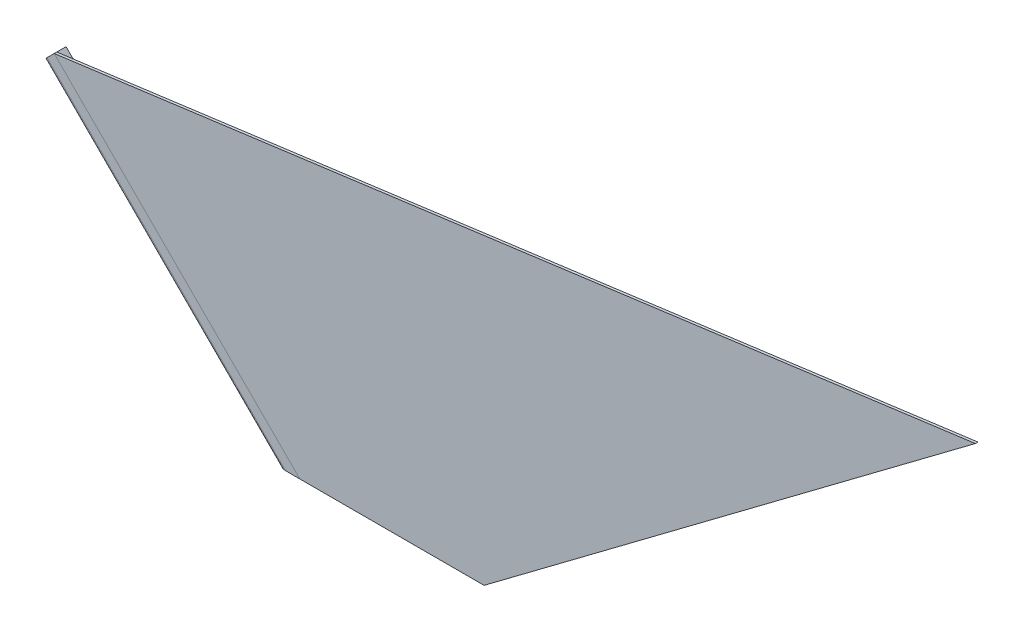
ISO-10303-21;
HEADER;
FILE_DESCRIPTION(('STEP AP214'),'2;1');
FILE_NAME('part.step','',(''),(''),'','','');
FILE_SCHEMA(('AUTOMOTIVE_DESIGN { 1 0 10303 214 1 1 1 1 }'));
ENDSEC;
DATA;
#1=APPLICATION_CONTEXT('core data for automotive mechanical design processes');
#2=APPLICATION_PROTOCOL_DEFINITION('international standard','automotive_design',2000,#1);
#3=PRODUCT_CONTEXT('',#1,'mechanical');
#4=PRODUCT('Part','Part','',(#3));
#5=PRODUCT_RELATED_PRODUCT_CATEGORY('part','',(#4));
#6=PRODUCT_DEFINITION_FORMATION('','',#4);
#7=PRODUCT_DEFINITION_CONTEXT('part definition',#1,'design');
#8=PRODUCT_DEFINITION('design','',#6,#7);
#9=PRODUCT_DEFINITION_SHAPE('','',#8);
#10=(LENGTH_UNIT() NAMED_UNIT(*) SI_UNIT(.MILLI.,.METRE.));
#11=(NAMED_UNIT(*) PLANE_ANGLE_UNIT() SI_UNIT($,.RADIAN.));
#12=(NAMED_UNIT(*) SI_UNIT($,.STERADIAN.) SOLID_ANGLE_UNIT());
#13=UNCERTAINTY_MEASURE_WITH_UNIT(LENGTH_MEASURE(1.E-05),#10,'distance_accuracy_value','');
#14=(GEOMETRIC_REPRESENTATION_CONTEXT(3) GLOBAL_UNCERTAINTY_ASSIGNED_CONTEXT((#13)) GLOBAL_UNIT_ASSIGNED_CONTEXT((#10,
#11,#12)) REPRESENTATION_CONTEXT('',''));
#15=CARTESIAN_POINT('',(0.,0.,0.));
#16=DIRECTION('',(0.,0.,1.));
#17=DIRECTION('',(1.,0.,0.));
#18=AXIS2_PLACEMENT_3D('',#15,#16,#17);
#19=CARTESIAN_POINT('',(-158.856804151049,145.943195848951,-1.27));
#20=DIRECTION('',(-0.707106781186548,0.707106781186548,0.));
#21=DIRECTION('',(-0.707106781186548,-0.707106781186548,0.));
#22=AXIS2_PLACEMENT_3D('',#19,#20,#21);
#23=PLANE('',#22);
#24=DIRECTION('',(0.707106781186548,0.707106781186548,0.));
#25=VECTOR('',#24,1.);
#26=CARTESIAN_POINT('',(-158.856804151049,145.943195848951,-1.27));
#27=LINE('',#26,#25);
#28=CARTESIAN_POINT('',(-158.856804151049,145.943195848951,-1.27));
#29=VERTEX_POINT('',#28);
#30=CARTESIAN_POINT('',(-157.734272135915,147.065727864085,-1.27));
#31=VERTEX_POINT('',#30);
#32=EDGE_CURVE('E12',#29,#31,#27,.T.);
#33=ORIENTED_EDGE('',*,*,#32,.F.);
#34=CARTESIAN_POINT('',(-156.836246523808,147.963753476192,-1.27));
#35=DIRECTION('',(-0.707106781186548,0.707106781186548,0.));
#36=DIRECTION('',(-0.707106781186548,-0.707106781186548,0.));
#37=AXIS2_PLACEMENT_3D('',#34,#35,#36);
#38=CIRCLE('',#37,2.8575);
#39=CARTESIAN_POINT('',(-156.836246523808,147.963753476192,1.5875));
#40=VERTEX_POINT('',#39);
#41=EDGE_CURVE('E149',#40,#29,#38,.F.);
#42=ORIENTED_EDGE('',*,*,#41,.F.);
#43=DIRECTION('',(0.,0.,1.));
#44=VECTOR('',#43,1.);
#45=CARTESIAN_POINT('',(-156.836246523808,147.963753476192,0.));
#46=LINE('',#45,#44);
#47=CARTESIAN_POINT('',(-156.836246523808,147.963753476192,0.));
#48=VERTEX_POINT('',#47);
#49=EDGE_CURVE('E58',#48,#40,#46,.T.);
#50=ORIENTED_EDGE('',*,*,#49,.F.);
#51=CARTESIAN_POINT('',(-156.836246523808,147.963753476192,-1.27));
#52=DIRECTION('',(-0.707106781186548,0.707106781186548,0.));
#53=DIRECTION('',(0.,0.,-1.));
#54=AXIS2_PLACEMENT_3D('',#51,#52,#53);
#55=CIRCLE('',#54,1.27);
#56=EDGE_CURVE('E164',#48,#31,#55,.F.);
#57=ORIENTED_EDGE('',*,*,#56,.T.);
#58=EDGE_LOOP('',(#33,#42,#50,#57));
#59=FACE_BOUND('',#58,.T.);
#60=ADVANCED_FACE('F50',(#59),#23,.T.);
#61=CARTESIAN_POINT('',(-156.836246523808,147.963753476192,0.));
#62=DIRECTION('',(-0.707106781186548,0.707106781186548,0.));
#63=DIRECTION('',(-0.707106781186548,-0.707106781186548,0.));
#64=AXIS2_PLACEMENT_3D('',#61,#62,#63);
#65=PLANE('',#64);
#66=DIRECTION('',(0.,0.,-1.));
#67=VECTOR('',#66,1.);
#68=CARTESIAN_POINT('',(-158.856804151049,145.943195848951,1.5875));
#69=LINE('',#68,#67);
#70=CARTESIAN_POINT('',(-158.856804151049,145.943195848951,-11.1125));
#71=VERTEX_POINT('',#70);
#72=EDGE_CURVE('E205',#29,#71,#69,.T.);
#73=ORIENTED_EDGE('',*,*,#72,.F.);
#74=ORIENTED_EDGE('',*,*,#32,.T.);
#75=DIRECTION('',(0.,0.,-1.));
#76=VECTOR('',#75,1.);
#77=CARTESIAN_POINT('',(-157.734272135915,147.065727864085,1.5875));
#78=LINE('',#77,#76);
#79=CARTESIAN_POINT('',(-157.734272135915,147.065727864085,-11.1125));
#80=VERTEX_POINT('',#79);
#81=EDGE_CURVE('E221',#31,#80,#78,.T.);
#82=ORIENTED_EDGE('',*,*,#81,.T.);
#83=DIRECTION('',(0.707106781186548,0.707106781186548,0.));
#84=VECTOR('',#83,1.);
#85=CARTESIAN_POINT('',(-158.856804151049,145.943195848951,-11.1125));
#86=LINE('',#85,#84);
#87=EDGE_CURVE('E227',#71,#80,#86,.T.);
#88=ORIENTED_EDGE('',*,*,#87,.F.);
#89=EDGE_LOOP('',(#73,#74,#82,#88));
#90=FACE_BOUND('',#89,.T.);
#91=ADVANCED_FACE('F244',(#90),#65,.T.);
#92=CARTESIAN_POINT('',(4.78856633484592,-15.4571106066761,1.5875));
#93=DIRECTION('',(0.707106781186548,0.707106781186548,0.));
#94=DIRECTION('',(-0.707106781186548,0.707106781186548,0.));
#95=AXIS2_PLACEMENT_3D('',#92,#93,#94);
#96=PLANE('',#95);
#97=DIRECTION('',(-0.707106781186548,0.707106781186548,0.));
#98=VECTOR('',#97,1.);
#99=CARTESIAN_POINT('',(4.78856633484592,-15.4571106066761,-1.27));
#100=LINE('',#99,#98);
#101=CARTESIAN_POINT('',(-11.7910762869638,1.12253201513365,-1.27));
#102=VERTEX_POINT('',#101);
#103=EDGE_CURVE('E165',#102,#31,#100,.T.);
#104=ORIENTED_EDGE('',*,*,#103,.F.);
#105=DIRECTION('',(0.,0.,1.));
#106=VECTOR('',#105,1.);
#107=CARTESIAN_POINT('',(-11.7910762869638,1.12253201513364,1.5875));
#108=LINE('',#107,#106);
#109=CARTESIAN_POINT('',(-11.7910762869638,1.12253201513364,-11.1125));
#110=VERTEX_POINT('',#109);
#111=EDGE_CURVE('E131',#110,#102,#108,.T.);
#112=ORIENTED_EDGE('',*,*,#111,.F.);
#113=DIRECTION('',(-0.707106781186548,0.707106781186548,0.));
#114=VECTOR('',#113,1.);
#115=CARTESIAN_POINT('',(4.78856633484592,-15.4571106066761,-11.1125));
#116=LINE('',#115,#114);
#117=EDGE_CURVE('E158',#110,#80,#116,.T.);
#118=ORIENTED_EDGE('',*,*,#117,.T.);
#119=ORIENTED_EDGE('',*,*,#81,.F.);
#120=EDGE_LOOP('',(#104,#112,#118,#119));
#121=FACE_BOUND('',#120,.T.);
#122=ADVANCED_FACE('F222',(#121),#96,.T.);
#123=CARTESIAN_POINT('',(5.68659194695287,-14.5590849945691,-1.27));
#124=DIRECTION('',(-0.707106781186548,0.707106781186548,0.));
#125=DIRECTION('',(-0.707106781186548,-0.707106781186548,0.));
#126=AXIS2_PLACEMENT_3D('',#123,#124,#125);
#127=CYLINDRICAL_SURFACE('',#126,1.27);
#128=DIRECTION('',(-0.707106781186548,0.707106781186548,0.));
#129=VECTOR('',#128,1.);
#130=CARTESIAN_POINT('',(5.68659194695287,-14.5590849945691,0.));
#131=LINE('',#130,#129);
#132=CARTESIAN_POINT('',(-8.87249304761628,0.,0.));
#133=VERTEX_POINT('',#132);
#134=EDGE_CURVE('E168',#133,#48,#131,.T.);
#135=ORIENTED_EDGE('',*,*,#134,.F.);
#136=CARTESIAN_POINT('',(-8.87249304761628,0.,0.));
#137=CARTESIAN_POINT('',(-8.97990035737662,0.041310503754024,-2.84074469528321E-05));
#138=CARTESIAN_POINT('',(-9.08731642119603,0.0826243744537719,-0.00258176607408671));
#139=CARTESIAN_POINT('',(-9.30251981168437,0.165394909256933,-0.0129652391565513));
#140=CARTESIAN_POINT('',(-9.41030590779784,0.206851100069783,-0.020824448012069));
#141=CARTESIAN_POINT('',(-9.6256485485179,0.289675192654517,-0.0420742437074032));
#142=CARTESIAN_POINT('',(-9.73320405501698,0.331042695154281,-0.0554770504268105));
#143=CARTESIAN_POINT('',(-9.94699261326504,0.413269063711224,-0.0881757209866942));
#144=CARTESIAN_POINT('',(-10.0532295926113,0.454129440382759,-0.107441680891336));
#145=CARTESIAN_POINT('',(-10.2643077880244,0.535313361695395,-0.152539948879866));
#146=CARTESIAN_POINT('',(-10.3691510432101,0.575637690612987,-0.178361208890602));
#147=CARTESIAN_POINT('',(-10.5768255034913,0.65551248302888,-0.237617930507188));
#148=CARTESIAN_POINT('',(-10.6796596791354,0.695064089045806,-0.271041052929458));
#149=CARTESIAN_POINT('',(-10.8154474198744,0.747290143176187,-0.322116269602496));
#150=CARTESIAN_POINT('',(-10.8497673145441,0.760490102664537,-0.335635219039178));
#151=CARTESIAN_POINT('',(-10.9179776026383,0.786724828854628,-0.363864516554097));
#152=CARTESIAN_POINT('',(-10.951867977012,0.799759588229113,-0.378574917265352));
#153=CARTESIAN_POINT('',(-11.0531485279253,0.838713646272707,-0.42482302070147));
#154=CARTESIAN_POINT('',(-11.1197790489255,0.864340769734326,-0.458341781147276));
#155=CARTESIAN_POINT('',(-11.2264979029612,0.905386482824975,-0.518646467039939));
#156=CARTESIAN_POINT('',(-11.2675247411611,0.921166035978759,-0.543527325698283));
#157=CARTESIAN_POINT('',(-11.3478475553631,0.95205942605646,-0.596432048009351));
#158=CARTESIAN_POINT('',(-11.3871420082739,0.967172677176012,-0.624458603483086));
#159=CARTESIAN_POINT('',(-11.4629683693596,0.996336662208959,-0.683986356518847));
#160=CARTESIAN_POINT('',(-11.4995179140532,1.01039417939881,-0.715461465533412));
#161=CARTESIAN_POINT('',(-11.5689796584078,1.0371102349198,-0.78267056435937));
#162=CARTESIAN_POINT('',(-11.6019001283773,1.04977195413885,-0.818394468084932));
#163=CARTESIAN_POINT('',(-11.6542871448456,1.06992080662666,-0.884615365051905));
#164=CARTESIAN_POINT('',(-11.6750011980869,1.07788775018102,-0.913968549718548));
#165=CARTESIAN_POINT('',(-11.7124602302953,1.09229507026115,-0.975499086311298));
#166=CARTESIAN_POINT('',(-11.7292075543304,1.09873634873619,-1.00767475413285));
#167=CARTESIAN_POINT('',(-11.7553450002232,1.10878921254113,-1.06975848414488));
#168=CARTESIAN_POINT('',(-11.7654505305935,1.11267595499124,-1.09931679626145));
#169=CARTESIAN_POINT('',(-11.7809038465429,1.1186195380487,-1.15980925416742));
#170=CARTESIAN_POINT('',(-11.7862640529346,1.12068115589168,-1.19073958427366));
#171=CARTESIAN_POINT('',(-11.7896791430526,1.12199465209088,-1.22988864984594));
#172=CARTESIAN_POINT('',(-11.7902026517786,1.12219600160088,-1.23790235721289));
#173=CARTESIAN_POINT('',(-11.7909008176836,1.12246452694897,-1.25394306601032));
#174=CARTESIAN_POINT('',(-11.7910756543296,1.12253177181282,-1.2619700584722));
#175=CARTESIAN_POINT('',(-11.7910762869638,1.12253201513364,-1.27));
#176=B_SPLINE_CURVE_WITH_KNOTS('',3,(#136,#137,#138,#139,#140,#141,#142,#143,#144,#145,#146,
#147,#148,#149,#150,#151,#152,#153,#154,#155,#156,#157,#158,#159,#160,#161,#162,#163,#164,#165,
#166,#167,#168,#169,#170,#171,#172,#173,#174,#175),.UNSPECIFIED.,.F.,.F.,(4,2,2,2,2,2,2,2,2,2,2,
2,2,2,2,2,2,2,2,4),(0.,0.345220297635823,0.692349138928181,1.04024727708805,1.38639994589045,
1.73197304979134,2.07698917995531,2.19450279832984,2.31202161076757,2.54831130560641,
2.6997427013205,2.85130468161468,3.0017903460329,3.1519256514949,3.26205437403111,
3.37211782677707,3.4661900299202,3.56001526621733,3.58410945098179,3.6081912308874),.UNSPECIFIED.);
#177=EDGE_CURVE('E133',#133,#102,#176,.T.);
#178=ORIENTED_EDGE('',*,*,#177,.T.);
#179=ORIENTED_EDGE('',*,*,#103,.T.);
#180=ORIENTED_EDGE('',*,*,#56,.F.);
#181=EDGE_LOOP('',(#135,#178,#179,#180));
#182=FACE_BOUND('',#181,.T.);
#183=ADVANCED_FACE('F217',(#182),#127,.F.);
#184=CARTESIAN_POINT('',(10.122838470761,-10.122838470761,0.));
#185=DIRECTION('',(0.,0.,-1.));
#186=DIRECTION('',(-1.,0.,0.));
#187=AXIS2_PLACEMENT_3D('',#184,#185,#186);
#188=PLANE('',#187);
#189=DIRECTION('',(-0.707106781186548,0.707106781186548,0.));
#190=VECTOR('',#189,1.);
#191=CARTESIAN_POINT('',(10.122838470761,-10.122838470761,0.));
#192=LINE('',#191,#190);
#193=CARTESIAN_POINT('',(0.,0.,0.));
#194=VERTEX_POINT('',#193);
#195=CARTESIAN_POINT('',(-152.4,152.4,0.));
#196=VERTEX_POINT('',#195);
#197=EDGE_CURVE('E176',#194,#196,#192,.T.);
#198=ORIENTED_EDGE('',*,*,#197,.F.);
#199=DIRECTION('',(-1.,0.,0.));
#200=VECTOR('',#199,1.);
#201=CARTESIAN_POINT('',(10.122838470761,0.,0.));
#202=LINE('',#201,#200);
#203=EDGE_CURVE('E259',#133,#194,#202,.F.);
#204=ORIENTED_EDGE('',*,*,#203,.F.);
#205=ORIENTED_EDGE('',*,*,#134,.T.);
#206=DIRECTION('',(-0.707106781186548,-0.707106781186548,0.));
#207=VECTOR('',#206,1.);
#208=CARTESIAN_POINT('',(-152.4,152.4,0.));
#209=LINE('',#208,#207);
#210=EDGE_CURVE('E198',#196,#48,#209,.T.);
#211=ORIENTED_EDGE('',*,*,#210,.F.);
#212=EDGE_LOOP('',(#198,#204,#205,#211));
#213=FACE_BOUND('',#212,.T.);
#214=ADVANCED_FACE('F270',(#213),#188,.T.);
#215=CARTESIAN_POINT('',(10.122838470761,-10.122838470761,0.));
#216=DIRECTION('',(-0.707106781186548,-0.707106781186548,0.));
#217=DIRECTION('',(0.707106781186548,-0.707106781186548,0.));
#218=AXIS2_PLACEMENT_3D('',#215,#216,#217);
#219=PLANE('',#218);
#220=DIRECTION('',(0.,0.,1.));
#221=VECTOR('',#220,1.);
#222=CARTESIAN_POINT('',(0.,0.,1.5875));
#223=LINE('',#222,#221);
#224=CARTESIAN_POINT('',(0.,0.,1.5875));
#225=VERTEX_POINT('',#224);
#226=EDGE_CURVE('E145',#225,#194,#223,.F.);
#227=ORIENTED_EDGE('',*,*,#226,.T.);
#228=ORIENTED_EDGE('',*,*,#197,.T.);
#229=DIRECTION('',(0.,0.,1.));
#230=VECTOR('',#229,1.);
#231=CARTESIAN_POINT('',(-152.4,152.4,0.));
#232=LINE('',#231,#230);
#233=CARTESIAN_POINT('',(-152.4,152.4,1.5875));
#234=VERTEX_POINT('',#233);
#235=EDGE_CURVE('E191',#196,#234,#232,.T.);
#236=ORIENTED_EDGE('',*,*,#235,.T.);
#237=DIRECTION('',(-0.707106781186548,0.707106781186548,0.));
#238=VECTOR('',#237,1.);
#239=CARTESIAN_POINT('',(10.122838470761,-10.122838470761,1.5875));
#240=LINE('',#239,#238);
#241=EDGE_CURVE('E156',#225,#234,#240,.T.);
#242=ORIENTED_EDGE('',*,*,#241,.F.);
#243=EDGE_LOOP('',(#227,#228,#236,#242));
#244=FACE_BOUND('',#243,.T.);
#245=ADVANCED_FACE('F192',(#244),#219,.F.);
#246=CARTESIAN_POINT('',(10.122838470761,-10.122838470761,1.5875));
#247=DIRECTION('',(0.,0.,-1.));
#248=DIRECTION('',(-1.,0.,0.));
#249=AXIS2_PLACEMENT_3D('',#246,#247,#248);
#250=PLANE('',#249);
#251=DIRECTION('',(1.,0.,0.));
#252=VECTOR('',#251,1.);
#253=CARTESIAN_POINT('',(10.122838470761,0.,1.5875));
#254=LINE('',#253,#252);
#255=CARTESIAN_POINT('',(-8.87249304761628,0.,1.5875));
#256=VERTEX_POINT('',#255);
#257=EDGE_CURVE('E127',#256,#225,#254,.T.);
#258=ORIENTED_EDGE('',*,*,#257,.T.);
#259=ORIENTED_EDGE('',*,*,#241,.T.);
#260=DIRECTION('',(-0.707106781186548,-0.707106781186548,0.));
#261=VECTOR('',#260,1.);
#262=CARTESIAN_POINT('',(-152.4,152.4,1.5875));
#263=LINE('',#262,#261);
#264=EDGE_CURVE('E187',#234,#40,#263,.T.);
#265=ORIENTED_EDGE('',*,*,#264,.T.);
#266=DIRECTION('',(-0.707106781186548,0.707106781186548,0.));
#267=VECTOR('',#266,1.);
#268=CARTESIAN_POINT('',(5.68659194695287,-14.5590849945691,1.5875));
#269=LINE('',#268,#267);
#270=EDGE_CURVE('E151',#256,#40,#269,.T.);
#271=ORIENTED_EDGE('',*,*,#270,.F.);
#272=EDGE_LOOP('',(#258,#259,#265,#271));
#273=FACE_BOUND('',#272,.T.);
#274=ADVANCED_FACE('F185',(#273),#250,.F.);
#275=CARTESIAN_POINT('',(5.68659194695287,-14.5590849945691,-1.27));
#276=DIRECTION('',(-0.707106781186548,0.707106781186548,0.));
#277=DIRECTION('',(-0.707106781186548,-0.707106781186548,0.));
#278=AXIS2_PLACEMENT_3D('',#275,#276,#277);
#279=CYLINDRICAL_SURFACE('',#278,2.8575);
#280=CARTESIAN_POINT('',(-8.87249304761628,0.,-1.27));
#281=DIRECTION('',(0.,1.,0.));
#282=DIRECTION('',(-1.,0.,0.));
#283=AXIS2_PLACEMENT_3D('',#280,#281,#282);
#284=ELLIPSE('',#283,4.04111525448112,2.8575);
#285=CARTESIAN_POINT('',(-12.9136083020974,0.,-1.27));
#286=VERTEX_POINT('',#285);
#287=EDGE_CURVE('E115',#286,#256,#284,.T.);
#288=ORIENTED_EDGE('',*,*,#287,.T.);
#289=ORIENTED_EDGE('',*,*,#270,.T.);
#290=ORIENTED_EDGE('',*,*,#41,.T.);
#291=DIRECTION('',(-0.707106781186548,0.707106781186548,0.));
#292=VECTOR('',#291,1.);
#293=CARTESIAN_POINT('',(3.6660343197123,-16.5796426218097,-1.27));
#294=LINE('',#293,#292);
#295=EDGE_CURVE('E141',#286,#29,#294,.T.);
#296=ORIENTED_EDGE('',*,*,#295,.F.);
#297=EDGE_LOOP('',(#288,#289,#290,#296));
#298=FACE_BOUND('',#297,.T.);
#299=ADVANCED_FACE('F147',(#298),#279,.T.);
#300=CARTESIAN_POINT('',(3.6660343197123,-16.5796426218097,1.5875));
#301=DIRECTION('',(0.707106781186548,0.707106781186548,0.));
#302=DIRECTION('',(-0.707106781186548,0.707106781186548,0.));
#303=AXIS2_PLACEMENT_3D('',#300,#301,#302);
#304=PLANE('',#303);
#305=DIRECTION('',(0.,0.,1.));
#306=VECTOR('',#305,1.);
#307=CARTESIAN_POINT('',(-12.9136083020974,0.,1.5875));
#308=LINE('',#307,#306);
#309=CARTESIAN_POINT('',(-12.9136083020974,0.,-11.1125));
#310=VERTEX_POINT('',#309);
#311=EDGE_CURVE('E65',#310,#286,#308,.T.);
#312=ORIENTED_EDGE('',*,*,#311,.T.);
#313=ORIENTED_EDGE('',*,*,#295,.T.);
#314=ORIENTED_EDGE('',*,*,#72,.T.);
#315=DIRECTION('',(-0.707106781186548,0.707106781186548,0.));
#316=VECTOR('',#315,1.);
#317=CARTESIAN_POINT('',(3.6660343197123,-16.5796426218097,-11.1125));
#318=LINE('',#317,#316);
#319=EDGE_CURVE('E143',#310,#71,#318,.T.);
#320=ORIENTED_EDGE('',*,*,#319,.F.);
#321=EDGE_LOOP('',(#312,#313,#314,#320));
#322=FACE_BOUND('',#321,.T.);
#323=ADVANCED_FACE('F139',(#322),#304,.F.);
#324=CARTESIAN_POINT('',(3.6660343197123,-16.5796426218097,-11.1125));
#325=DIRECTION('',(0.,0.,1.));
#326=DIRECTION('',(1.,0.,0.));
#327=AXIS2_PLACEMENT_3D('',#324,#325,#326);
#328=PLANE('',#327);
#329=DIRECTION('',(-0.707106781186548,-0.707106781186548,0.));
#330=VECTOR('',#329,1.);
#331=CARTESIAN_POINT('',(-12.9136083020974,0.,-11.1125));
#332=LINE('',#331,#330);
#333=EDGE_CURVE('E134',#310,#110,#332,.F.);
#334=ORIENTED_EDGE('',*,*,#333,.F.);
#335=ORIENTED_EDGE('',*,*,#319,.T.);
#336=ORIENTED_EDGE('',*,*,#87,.T.);
#337=ORIENTED_EDGE('',*,*,#117,.F.);
#338=EDGE_LOOP('',(#334,#335,#336,#337));
#339=FACE_BOUND('',#338,.T.);
#340=ADVANCED_FACE('F246',(#339),#328,.F.);
#341=CARTESIAN_POINT('',(-156.836246523808,147.963753476192,-1.27));
#342=DIRECTION('',(-0.707106781186548,0.707106781186548,0.));
#343=DIRECTION('',(0.,0.,-1.));
#344=AXIS2_PLACEMENT_3D('',#341,#342,#343);
#345=PLANE('',#344);
#346=ORIENTED_EDGE('',*,*,#210,.T.);
#347=ORIENTED_EDGE('',*,*,#49,.T.);
#348=ORIENTED_EDGE('',*,*,#264,.F.);
#349=ORIENTED_EDGE('',*,*,#235,.F.);
#350=EDGE_LOOP('',(#346,#347,#348,#349));
#351=FACE_BOUND('',#350,.T.);
#352=ADVANCED_FACE('F200',(#351),#345,.T.);
#353=CARTESIAN_POINT('',(-12.9136083020974,0.,1.5875));
#354=DIRECTION('',(-0.707106781186548,0.707106781186548,0.));
#355=DIRECTION('',(0.,0.,1.));
#356=AXIS2_PLACEMENT_3D('',#353,#354,#355);
#357=PLANE('',#356);
#358=DIRECTION('',(-0.707106781186548,-0.707106781186548,0.));
#359=VECTOR('',#358,1.);
#360=CARTESIAN_POINT('',(-12.9136083020974,0.,-1.27));
#361=LINE('',#360,#359);
#362=EDGE_CURVE('E117',#286,#102,#361,.F.);
#363=ORIENTED_EDGE('',*,*,#362,.F.);
#364=ORIENTED_EDGE('',*,*,#311,.F.);
#365=ORIENTED_EDGE('',*,*,#333,.T.);
#366=ORIENTED_EDGE('',*,*,#111,.T.);
#367=EDGE_LOOP('',(#363,#364,#365,#366));
#368=FACE_BOUND('',#367,.T.);
#369=ADVANCED_FACE('F129',(#368),#357,.F.);
#370=CARTESIAN_POINT('',(10.122838470761,0.,1.5875));
#371=DIRECTION('',(0.,1.,0.));
#372=DIRECTION('',(1.,0.,0.));
#373=AXIS2_PLACEMENT_3D('',#370,#371,#372);
#374=PLANE('',#373);
#375=ORIENTED_EDGE('',*,*,#226,.F.);
#376=ORIENTED_EDGE('',*,*,#257,.F.);
#377=DIRECTION('',(0.,0.,1.));
#378=VECTOR('',#377,1.);
#379=CARTESIAN_POINT('',(-8.87249304761628,0.,1.5875));
#380=LINE('',#379,#378);
#381=EDGE_CURVE('E120',#256,#133,#380,.F.);
#382=ORIENTED_EDGE('',*,*,#381,.T.);
#383=ORIENTED_EDGE('',*,*,#203,.T.);
#384=EDGE_LOOP('',(#375,#376,#382,#383));
#385=FACE_BOUND('',#384,.T.);
#386=ADVANCED_FACE('F268',(#385),#374,.F.);
#387=CARTESIAN_POINT('',(-11.6496549307264,1.26395337137095,-1.27));
#388=CARTESIAN_POINT('',(-12.0709727211834,0.842635580913968,-1.27));
#389=CARTESIAN_POINT('',(-12.4922905116404,0.421317790456984,-1.27));
#390=CARTESIAN_POINT('',(-12.9136083020974,0.,-1.27));
#391=CARTESIAN_POINT('',(-11.6496549307264,1.26395337137095,0.869999999999999));
#392=CARTESIAN_POINT('',(-12.0709727211834,0.842635580913968,2.06166666666667));
#393=CARTESIAN_POINT('',(-12.4922905116404,0.421317790456984,3.25333333333333));
#394=CARTESIAN_POINT('',(-12.9136083020974,0.,4.445));
#395=CARTESIAN_POINT('',(-6.09533116450612,-1.26395337137095,0.87));
#396=CARTESIAN_POINT('',(-5.67401337404913,-0.842635580913968,2.06166666666667));
#397=CARTESIAN_POINT('',(-5.25269558359215,-0.421317790456984,3.25333333333333));
#398=CARTESIAN_POINT('',(-4.83137779313516,0.,4.445));
#399=CARTESIAN_POINT('',(-6.09533116450612,-1.26395337137095,-1.27));
#400=CARTESIAN_POINT('',(-5.67401337404913,-0.842635580913968,-1.27));
#401=CARTESIAN_POINT('',(-5.25269558359215,-0.421317790456984,-1.27));
#402=CARTESIAN_POINT('',(-4.83137779313516,0.,-1.27));
#403=CARTESIAN_POINT('',(-6.09533116450612,-1.26395337137095,-3.41));
#404=CARTESIAN_POINT('',(-5.67401337404913,-0.842635580913969,-4.60166666666666));
#405=CARTESIAN_POINT('',(-5.25269558359215,-0.421317790456984,-5.79333333333333));
#406=CARTESIAN_POINT('',(-4.83137779313516,0.,-6.985));
#407=CARTESIAN_POINT('',(-11.6496549307264,1.26395337137095,-3.41));
#408=CARTESIAN_POINT('',(-12.0709727211834,0.842635580913968,-4.60166666666666));
#409=CARTESIAN_POINT('',(-12.4922905116404,0.421317790456984,-5.79333333333333));
#410=CARTESIAN_POINT('',(-12.9136083020974,0.,-6.985));
#411=CARTESIAN_POINT('',(-11.6496549307264,1.26395337137095,-1.27));
#412=CARTESIAN_POINT('',(-12.0709727211834,0.842635580913968,-1.27));
#413=CARTESIAN_POINT('',(-12.4922905116404,0.421317790456984,-1.27));
#414=CARTESIAN_POINT('',(-12.9136083020974,0.,-1.27));
#415=(BOUNDED_SURFACE() B_SPLINE_SURFACE(3,3,((#387,#388,#389,#390),(#391,#392,#393,#394),(#395,
#396,#397,#398),(#399,#400,#401,#402),(#403,#404,#405,#406),(#407,#408,#409,#410),(#411,#412,
#413,#414)),.UNSPECIFIED.,.T.,.F.,.F.) B_SPLINE_SURFACE_WITH_KNOTS((4,3,4),(4,4),(0.,0.5,1.),
(0.,1.),.UNSPECIFIED.) GEOMETRIC_REPRESENTATION_ITEM() RATIONAL_B_SPLINE_SURFACE(((1.,1.,1.,1.),
(0.333333333333333,0.333333333333333,0.333333333333333,0.333333333333333),(0.333333333333333,
0.333333333333333,0.333333333333333,0.333333333333333),(1.,1.,1.,1.),(0.333333333333333,
0.333333333333333,0.333333333333333,0.333333333333333),(0.333333333333333,0.333333333333333,
0.333333333333333,0.333333333333333),(1.,1.,1.,1.))) REPRESENTATION_ITEM('') SURFACE());
#416=ORIENTED_EDGE('',*,*,#381,.F.);
#417=ORIENTED_EDGE('',*,*,#287,.F.);
#418=ORIENTED_EDGE('',*,*,#362,.T.);
#419=ORIENTED_EDGE('',*,*,#177,.F.);
#420=EDGE_LOOP('',(#416,#417,#418,#419));
#421=FACE_BOUND('',#420,.T.);
#422=ADVANCED_FACE('F116',(#421),#415,.T.);
#423=CLOSED_SHELL('',(#60,#91,#122,#183,#214,#245,#274,#299,#323,#340,#352,#369,#386,#422));
#424=MANIFOLD_SOLID_BREP('B2',#423);
#425=CARTESIAN_POINT('',(-152.4,152.4,1.5875));
#426=DIRECTION('',(0.707106781186548,0.707106781186548,0.));
#427=DIRECTION('',(-0.707106781186548,0.707106781186548,0.));
#428=AXIS2_PLACEMENT_3D('',#425,#426,#427);
#429=PLANE('',#428);
#430=DIRECTION('',(0.707106781186547,-0.707106781186547,0.));
#431=VECTOR('',#430,1.);
#432=CARTESIAN_POINT('',(-152.4,152.4,0.));
#433=LINE('',#432,#431);
#434=CARTESIAN_POINT('',(-152.4,152.4,0.));
#435=VERTEX_POINT('',#434);
#436=CARTESIAN_POINT('',(0.,0.,0.));
#437=VERTEX_POINT('',#436);
#438=EDGE_CURVE('E535',#435,#437,#433,.T.);
#439=ORIENTED_EDGE('',*,*,#438,.T.);
#440=DIRECTION('',(0.,0.,-1.));
#441=VECTOR('',#440,1.);
#442=CARTESIAN_POINT('',(0.,0.,1.5875));
#443=LINE('',#442,#441);
#444=CARTESIAN_POINT('',(0.,0.,1.5875));
#445=VERTEX_POINT('',#444);
#446=EDGE_CURVE('E48',#445,#437,#443,.T.);
#447=ORIENTED_EDGE('',*,*,#446,.F.);
#448=DIRECTION('',(0.707106781186547,-0.707106781186547,0.));
#449=VECTOR('',#448,1.);
#450=CARTESIAN_POINT('',(-152.4,152.4,1.5875));
#451=LINE('',#450,#449);
#452=CARTESIAN_POINT('',(-152.4,152.4,1.5875));
#453=VERTEX_POINT('',#452);
#454=EDGE_CURVE('E518',#453,#445,#451,.T.);
#455=ORIENTED_EDGE('',*,*,#454,.F.);
#456=DIRECTION('',(0.,0.,-1.));
#457=VECTOR('',#456,1.);
#458=CARTESIAN_POINT('',(-152.4,152.4,1.5875));
#459=LINE('',#458,#457);
#460=EDGE_CURVE('E531',#453,#435,#459,.T.);
#461=ORIENTED_EDGE('',*,*,#460,.T.);
#462=EDGE_LOOP('',(#439,#447,#455,#461));
#463=FACE_BOUND('',#462,.T.);
#464=ADVANCED_FACE('F466',(#463),#429,.F.);
#465=CARTESIAN_POINT('',(0.,0.,1.5875));
#466=DIRECTION('',(0.,1.,0.));
#467=DIRECTION('',(0.,0.,1.));
#468=AXIS2_PLACEMENT_3D('',#465,#466,#467);
#469=PLANE('',#468);
#470=DIRECTION('',(1.,0.,0.));
#471=VECTOR('',#470,1.);
#472=CARTESIAN_POINT('',(0.,0.,0.));
#473=LINE('',#472,#471);
#474=CARTESIAN_POINT('',(114.3,0.,0.));
#475=VERTEX_POINT('',#474);
#476=EDGE_CURVE('E523',#437,#475,#473,.T.);
#477=ORIENTED_EDGE('',*,*,#476,.T.);
#478=DIRECTION('',(0.,0.,-1.));
#479=VECTOR('',#478,1.);
#480=CARTESIAN_POINT('',(114.3,0.,1.5875));
#481=LINE('',#480,#479);
#482=CARTESIAN_POINT('',(114.3,0.,1.5875));
#483=VERTEX_POINT('',#482);
#484=EDGE_CURVE('E475',#483,#475,#481,.T.);
#485=ORIENTED_EDGE('',*,*,#484,.F.);
#486=DIRECTION('',(1.,0.,0.));
#487=VECTOR('',#486,1.);
#488=CARTESIAN_POINT('',(0.,0.,1.5875));
#489=LINE('',#488,#487);
#490=EDGE_CURVE('E513',#445,#483,#489,.T.);
#491=ORIENTED_EDGE('',*,*,#490,.F.);
#492=ORIENTED_EDGE('',*,*,#446,.T.);
#493=EDGE_LOOP('',(#477,#485,#491,#492));
#494=FACE_BOUND('',#493,.T.);
#495=ADVANCED_FACE('F522',(#494),#469,.F.);
#496=CARTESIAN_POINT('',(114.3,0.,1.5875));
#497=DIRECTION('',(-0.6,0.8,0.));
#498=DIRECTION('',(-0.8,-0.6,0.));
#499=AXIS2_PLACEMENT_3D('',#496,#497,#498);
#500=PLANE('',#499);
#501=DIRECTION('',(0.8,0.6,0.));
#502=VECTOR('',#501,1.);
#503=CARTESIAN_POINT('',(114.3,0.,0.));
#504=LINE('',#503,#502);
#505=CARTESIAN_POINT('',(419.1,228.6,0.));
#506=VERTEX_POINT('',#505);
#507=EDGE_CURVE('E500',#475,#506,#504,.T.);
#508=ORIENTED_EDGE('',*,*,#507,.T.);
#509=DIRECTION('',(0.,0.,-1.));
#510=VECTOR('',#509,1.);
#511=CARTESIAN_POINT('',(419.1,228.6,1.5875));
#512=LINE('',#511,#510);
#513=CARTESIAN_POINT('',(419.1,228.6,1.5875));
#514=VERTEX_POINT('',#513);
#515=EDGE_CURVE('E525',#514,#506,#512,.T.);
#516=ORIENTED_EDGE('',*,*,#515,.F.);
#517=DIRECTION('',(0.8,0.6,0.));
#518=VECTOR('',#517,1.);
#519=CARTESIAN_POINT('',(114.3,0.,1.5875));
#520=LINE('',#519,#518);
#521=EDGE_CURVE('E516',#483,#514,#520,.T.);
#522=ORIENTED_EDGE('',*,*,#521,.F.);
#523=ORIENTED_EDGE('',*,*,#484,.T.);
#524=EDGE_LOOP('',(#508,#516,#522,#523));
#525=FACE_BOUND('',#524,.T.);
#526=ADVANCED_FACE('F526',(#525),#500,.F.);
#527=CARTESIAN_POINT('',(419.1,228.6,1.5875));
#528=DIRECTION('',(0.132163720091018,-0.991227900682635,0.));
#529=DIRECTION('',(0.991227900682635,0.132163720091018,0.));
#530=AXIS2_PLACEMENT_3D('',#527,#528,#529);
#531=PLANE('',#530);
#532=DIRECTION('',(-0.991227900682635,-0.132163720091018,0.));
#533=VECTOR('',#532,1.);
#534=CARTESIAN_POINT('',(419.1,228.6,0.));
#535=LINE('',#534,#533);
#536=EDGE_CURVE('E506',#506,#435,#535,.T.);
#537=ORIENTED_EDGE('',*,*,#536,.T.);
#538=ORIENTED_EDGE('',*,*,#460,.F.);
#539=DIRECTION('',(-0.991227900682635,-0.132163720091018,0.));
#540=VECTOR('',#539,1.);
#541=CARTESIAN_POINT('',(419.1,228.6,1.5875));
#542=LINE('',#541,#540);
#543=EDGE_CURVE('E483',#514,#453,#542,.T.);
#544=ORIENTED_EDGE('',*,*,#543,.F.);
#545=ORIENTED_EDGE('',*,*,#515,.T.);
#546=EDGE_LOOP('',(#537,#538,#544,#545));
#547=FACE_BOUND('',#546,.T.);
#548=ADVANCED_FACE('F549',(#547),#531,.F.);
#549=CARTESIAN_POINT('',(0.,0.,1.5875));
#550=DIRECTION('',(0.,0.,1.));
#551=DIRECTION('',(1.,0.,0.));
#552=AXIS2_PLACEMENT_3D('',#549,#550,#551);
#553=PLANE('',#552);
#554=ORIENTED_EDGE('',*,*,#454,.T.);
#555=ORIENTED_EDGE('',*,*,#490,.T.);
#556=ORIENTED_EDGE('',*,*,#521,.T.);
#557=ORIENTED_EDGE('',*,*,#543,.T.);
#558=EDGE_LOOP('',(#554,#555,#556,#557));
#559=FACE_BOUND('',#558,.T.);
#560=ADVANCED_FACE('F514',(#559),#553,.T.);
#561=CARTESIAN_POINT('',(0.,0.,0.));
#562=DIRECTION('',(0.,0.,1.));
#563=DIRECTION('',(1.,0.,0.));
#564=AXIS2_PLACEMENT_3D('',#561,#562,#563);
#565=PLANE('',#564);
#566=ORIENTED_EDGE('',*,*,#438,.F.);
#567=ORIENTED_EDGE('',*,*,#536,.F.);
#568=ORIENTED_EDGE('',*,*,#507,.F.);
#569=ORIENTED_EDGE('',*,*,#476,.F.);
#570=EDGE_LOOP('',(#566,#567,#568,#569));
#571=FACE_BOUND('',#570,.T.);
#572=ADVANCED_FACE('F552',(#571),#565,.F.);
#573=CLOSED_SHELL('',(#464,#495,#526,#548,#560,#572));
#574=MANIFOLD_SOLID_BREP('B6',#573);
#575=ADVANCED_BREP_SHAPE_REPRESENTATION('',(#18,#424,#574),#14);
#576=SHAPE_DEFINITION_REPRESENTATION(#9,#575);
ENDSEC;
END-ISO-10303-21;
